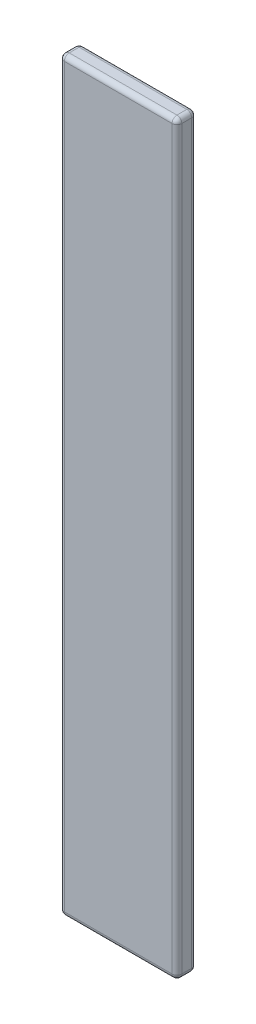
ISO-10303-21;
HEADER;
FILE_DESCRIPTION(('STEP AP214'),'2;1');
FILE_NAME('part.step','',(''),(''),'','','');
FILE_SCHEMA(('AUTOMOTIVE_DESIGN { 1 0 10303 214 1 1 1 1 }'));
ENDSEC;
DATA;
#1=APPLICATION_CONTEXT('core data for automotive mechanical design processes');
#2=APPLICATION_PROTOCOL_DEFINITION('international standard','automotive_design',2000,#1);
#3=PRODUCT_CONTEXT('',#1,'mechanical');
#4=PRODUCT('Part','Part','',(#3));
#5=PRODUCT_RELATED_PRODUCT_CATEGORY('part','',(#4));
#6=PRODUCT_DEFINITION_FORMATION('','',#4);
#7=PRODUCT_DEFINITION_CONTEXT('part definition',#1,'design');
#8=PRODUCT_DEFINITION('design','',#6,#7);
#9=PRODUCT_DEFINITION_SHAPE('','',#8);
#10=(LENGTH_UNIT() NAMED_UNIT(*) SI_UNIT(.MILLI.,.METRE.));
#11=(NAMED_UNIT(*) PLANE_ANGLE_UNIT() SI_UNIT($,.RADIAN.));
#12=(NAMED_UNIT(*) SI_UNIT($,.STERADIAN.) SOLID_ANGLE_UNIT());
#13=UNCERTAINTY_MEASURE_WITH_UNIT(LENGTH_MEASURE(1.E-05),#10,'distance_accuracy_value','');
#14=(GEOMETRIC_REPRESENTATION_CONTEXT(3) GLOBAL_UNCERTAINTY_ASSIGNED_CONTEXT((#13)) GLOBAL_UNIT_ASSIGNED_CONTEXT((#10,
#11,#12)) REPRESENTATION_CONTEXT('',''));
#15=CARTESIAN_POINT('',(0.,0.,0.));
#16=DIRECTION('',(0.,0.,1.));
#17=DIRECTION('',(1.,0.,0.));
#18=AXIS2_PLACEMENT_3D('',#15,#16,#17);
#19=CARTESIAN_POINT('',(24.,-152.5,8.));
#20=DIRECTION('',(-1.,0.,0.));
#21=DIRECTION('',(0.,0.,1.));
#22=AXIS2_PLACEMENT_3D('',#19,#20,#21);
#23=PLANE('',#22);
#24=DIRECTION('',(0.,1.,0.));
#25=VECTOR('',#24,1.);
#26=CARTESIAN_POINT('',(24.,-152.5,6.));
#27=LINE('',#26,#25);
#28=CARTESIAN_POINT('',(24.,150.5,6.));
#29=VERTEX_POINT('',#28);
#30=CARTESIAN_POINT('',(24.,-150.5,6.));
#31=VERTEX_POINT('',#30);
#32=EDGE_CURVE('E196',#29,#31,#27,.F.);
#33=ORIENTED_EDGE('',*,*,#32,.T.);
#34=DIRECTION('',(0.,0.,-1.));
#35=VECTOR('',#34,1.);
#36=CARTESIAN_POINT('',(24.,-150.5,8.));
#37=LINE('',#36,#35);
#38=CARTESIAN_POINT('',(24.,-150.5,2.));
#39=VERTEX_POINT('',#38);
#40=EDGE_CURVE('E201',#31,#39,#37,.T.);
#41=ORIENTED_EDGE('',*,*,#40,.T.);
#42=DIRECTION('',(0.,1.,0.));
#43=VECTOR('',#42,1.);
#44=CARTESIAN_POINT('',(24.,152.5,2.));
#45=LINE('',#44,#43);
#46=CARTESIAN_POINT('',(24.,150.5,2.));
#47=VERTEX_POINT('',#46);
#48=EDGE_CURVE('E198',#39,#47,#45,.T.);
#49=ORIENTED_EDGE('',*,*,#48,.T.);
#50=DIRECTION('',(0.,0.,-1.));
#51=VECTOR('',#50,1.);
#52=CARTESIAN_POINT('',(24.,150.5,8.));
#53=LINE('',#52,#51);
#54=EDGE_CURVE('E194',#47,#29,#53,.F.);
#55=ORIENTED_EDGE('',*,*,#54,.T.);
#56=EDGE_LOOP('',(#33,#41,#49,#55));
#57=FACE_BOUND('',#56,.T.);
#58=ADVANCED_FACE('F39',(#57),#23,.F.);
#59=CARTESIAN_POINT('',(-24.,152.5,8.));
#60=DIRECTION('',(0.,-1.,0.));
#61=DIRECTION('',(0.,0.,-1.));
#62=AXIS2_PLACEMENT_3D('',#59,#60,#61);
#63=PLANE('',#62);
#64=DIRECTION('',(-1.,0.,0.));
#65=VECTOR('',#64,1.);
#66=CARTESIAN_POINT('',(-24.,152.5,2.));
#67=LINE('',#66,#65);
#68=CARTESIAN_POINT('',(22.,152.5,2.));
#69=VERTEX_POINT('',#68);
#70=CARTESIAN_POINT('',(-22.,152.5,2.));
#71=VERTEX_POINT('',#70);
#72=EDGE_CURVE('E138',#69,#71,#67,.T.);
#73=ORIENTED_EDGE('',*,*,#72,.T.);
#74=DIRECTION('',(0.,0.,-1.));
#75=VECTOR('',#74,1.);
#76=CARTESIAN_POINT('',(-22.,152.5,8.));
#77=LINE('',#76,#75);
#78=CARTESIAN_POINT('',(-22.,152.5,6.));
#79=VERTEX_POINT('',#78);
#80=EDGE_CURVE('E134',#71,#79,#77,.F.);
#81=ORIENTED_EDGE('',*,*,#80,.T.);
#82=DIRECTION('',(-1.,0.,0.));
#83=VECTOR('',#82,1.);
#84=CARTESIAN_POINT('',(-24.,152.5,6.));
#85=LINE('',#84,#83);
#86=CARTESIAN_POINT('',(22.,152.5,6.));
#87=VERTEX_POINT('',#86);
#88=EDGE_CURVE('E126',#79,#87,#85,.F.);
#89=ORIENTED_EDGE('',*,*,#88,.T.);
#90=DIRECTION('',(0.,0.,-1.));
#91=VECTOR('',#90,1.);
#92=CARTESIAN_POINT('',(22.,152.5,8.));
#93=LINE('',#92,#91);
#94=EDGE_CURVE('E131',#87,#69,#93,.T.);
#95=ORIENTED_EDGE('',*,*,#94,.T.);
#96=EDGE_LOOP('',(#73,#81,#89,#95));
#97=FACE_BOUND('',#96,.T.);
#98=ADVANCED_FACE('F129',(#97),#63,.F.);
#99=CARTESIAN_POINT('',(-24.,-152.5,8.));
#100=DIRECTION('',(1.,0.,0.));
#101=DIRECTION('',(0.,0.,-1.));
#102=AXIS2_PLACEMENT_3D('',#99,#100,#101);
#103=PLANE('',#102);
#104=DIRECTION('',(0.,-1.,0.));
#105=VECTOR('',#104,1.);
#106=CARTESIAN_POINT('',(-24.,-152.5,2.));
#107=LINE('',#106,#105);
#108=CARTESIAN_POINT('',(-24.,150.5,2.));
#109=VERTEX_POINT('',#108);
#110=CARTESIAN_POINT('',(-24.,-150.5,2.));
#111=VERTEX_POINT('',#110);
#112=EDGE_CURVE('E180',#109,#111,#107,.T.);
#113=ORIENTED_EDGE('',*,*,#112,.T.);
#114=DIRECTION('',(0.,0.,-1.));
#115=VECTOR('',#114,1.);
#116=CARTESIAN_POINT('',(-24.,-150.5,8.));
#117=LINE('',#116,#115);
#118=CARTESIAN_POINT('',(-24.,-150.5,6.));
#119=VERTEX_POINT('',#118);
#120=EDGE_CURVE('E183',#111,#119,#117,.F.);
#121=ORIENTED_EDGE('',*,*,#120,.T.);
#122=DIRECTION('',(0.,-1.,0.));
#123=VECTOR('',#122,1.);
#124=CARTESIAN_POINT('',(-24.,-152.5,6.));
#125=LINE('',#124,#123);
#126=CARTESIAN_POINT('',(-24.,150.5,6.));
#127=VERTEX_POINT('',#126);
#128=EDGE_CURVE('E178',#119,#127,#125,.F.);
#129=ORIENTED_EDGE('',*,*,#128,.T.);
#130=DIRECTION('',(0.,0.,-1.));
#131=VECTOR('',#130,1.);
#132=CARTESIAN_POINT('',(-24.,150.5,8.));
#133=LINE('',#132,#131);
#134=EDGE_CURVE('E176',#127,#109,#133,.T.);
#135=ORIENTED_EDGE('',*,*,#134,.T.);
#136=EDGE_LOOP('',(#113,#121,#129,#135));
#137=FACE_BOUND('',#136,.T.);
#138=ADVANCED_FACE('F269',(#137),#103,.F.);
#139=CARTESIAN_POINT('',(-24.,-152.5,8.));
#140=DIRECTION('',(0.,1.,0.));
#141=DIRECTION('',(0.,0.,1.));
#142=AXIS2_PLACEMENT_3D('',#139,#140,#141);
#143=PLANE('',#142);
#144=DIRECTION('',(1.,0.,0.));
#145=VECTOR('',#144,1.);
#146=CARTESIAN_POINT('',(24.,-152.5,2.));
#147=LINE('',#146,#145);
#148=CARTESIAN_POINT('',(-22.,-152.5,2.));
#149=VERTEX_POINT('',#148);
#150=CARTESIAN_POINT('',(22.,-152.5,2.));
#151=VERTEX_POINT('',#150);
#152=EDGE_CURVE('E189',#149,#151,#147,.T.);
#153=ORIENTED_EDGE('',*,*,#152,.T.);
#154=DIRECTION('',(0.,0.,-1.));
#155=VECTOR('',#154,1.);
#156=CARTESIAN_POINT('',(22.,-152.5,8.));
#157=LINE('',#156,#155);
#158=CARTESIAN_POINT('',(22.,-152.5,6.));
#159=VERTEX_POINT('',#158);
#160=EDGE_CURVE('E192',#151,#159,#157,.F.);
#161=ORIENTED_EDGE('',*,*,#160,.T.);
#162=DIRECTION('',(1.,0.,0.));
#163=VECTOR('',#162,1.);
#164=CARTESIAN_POINT('',(-24.,-152.5,6.));
#165=LINE('',#164,#163);
#166=CARTESIAN_POINT('',(-22.,-152.5,6.));
#167=VERTEX_POINT('',#166);
#168=EDGE_CURVE('E187',#159,#167,#165,.F.);
#169=ORIENTED_EDGE('',*,*,#168,.T.);
#170=DIRECTION('',(0.,0.,-1.));
#171=VECTOR('',#170,1.);
#172=CARTESIAN_POINT('',(-22.,-152.5,8.));
#173=LINE('',#172,#171);
#174=EDGE_CURVE('E185',#167,#149,#173,.T.);
#175=ORIENTED_EDGE('',*,*,#174,.T.);
#176=EDGE_LOOP('',(#153,#161,#169,#175));
#177=FACE_BOUND('',#176,.T.);
#178=ADVANCED_FACE('F278',(#177),#143,.F.);
#179=CARTESIAN_POINT('',(0.,0.,8.));
#180=DIRECTION('',(0.,0.,-1.));
#181=DIRECTION('',(-1.,0.,0.));
#182=AXIS2_PLACEMENT_3D('',#179,#180,#181);
#183=PLANE('',#182);
#184=DIRECTION('',(0.,-1.,0.));
#185=VECTOR('',#184,1.);
#186=CARTESIAN_POINT('',(-22.,0.,8.));
#187=LINE('',#186,#185);
#188=CARTESIAN_POINT('',(-22.,150.5,8.));
#189=VERTEX_POINT('',#188);
#190=CARTESIAN_POINT('',(-22.,-150.5,8.));
#191=VERTEX_POINT('',#190);
#192=EDGE_CURVE('E48',#189,#191,#187,.T.);
#193=ORIENTED_EDGE('',*,*,#192,.T.);
#194=DIRECTION('',(1.,0.,0.));
#195=VECTOR('',#194,1.);
#196=CARTESIAN_POINT('',(0.,-150.5,8.));
#197=LINE('',#196,#195);
#198=CARTESIAN_POINT('',(22.,-150.5,8.));
#199=VERTEX_POINT('',#198);
#200=EDGE_CURVE('E11',#191,#199,#197,.T.);
#201=ORIENTED_EDGE('',*,*,#200,.T.);
#202=DIRECTION('',(0.,1.,0.));
#203=VECTOR('',#202,1.);
#204=CARTESIAN_POINT('',(22.,0.,8.));
#205=LINE('',#204,#203);
#206=CARTESIAN_POINT('',(22.,150.5,8.));
#207=VERTEX_POINT('',#206);
#208=EDGE_CURVE('E203',#199,#207,#205,.T.);
#209=ORIENTED_EDGE('',*,*,#208,.T.);
#210=DIRECTION('',(-1.,0.,0.));
#211=VECTOR('',#210,1.);
#212=CARTESIAN_POINT('',(0.,150.5,8.));
#213=LINE('',#212,#211);
#214=EDGE_CURVE('E59',#207,#189,#213,.T.);
#215=ORIENTED_EDGE('',*,*,#214,.T.);
#216=EDGE_LOOP('',(#193,#201,#209,#215));
#217=FACE_BOUND('',#216,.T.);
#218=ADVANCED_FACE('F300',(#217),#183,.F.);
#219=CARTESIAN_POINT('',(0.,0.,0.));
#220=DIRECTION('',(0.,0.,-1.));
#221=DIRECTION('',(-1.,0.,0.));
#222=AXIS2_PLACEMENT_3D('',#219,#220,#221);
#223=PLANE('',#222);
#224=DIRECTION('',(0.,-1.,0.));
#225=VECTOR('',#224,1.);
#226=CARTESIAN_POINT('',(-22.,152.5,0.));
#227=LINE('',#226,#225);
#228=CARTESIAN_POINT('',(-22.,-150.5,0.));
#229=VERTEX_POINT('',#228);
#230=CARTESIAN_POINT('',(-22.,150.5,0.));
#231=VERTEX_POINT('',#230);
#232=EDGE_CURVE('E171',#229,#231,#227,.F.);
#233=ORIENTED_EDGE('',*,*,#232,.T.);
#234=DIRECTION('',(-1.,0.,0.));
#235=VECTOR('',#234,1.);
#236=CARTESIAN_POINT('',(24.,150.5,0.));
#237=LINE('',#236,#235);
#238=CARTESIAN_POINT('',(22.,150.5,0.));
#239=VERTEX_POINT('',#238);
#240=EDGE_CURVE('E173',#231,#239,#237,.F.);
#241=ORIENTED_EDGE('',*,*,#240,.T.);
#242=DIRECTION('',(0.,1.,0.));
#243=VECTOR('',#242,1.);
#244=CARTESIAN_POINT('',(22.,-152.5,0.));
#245=LINE('',#244,#243);
#246=CARTESIAN_POINT('',(22.,-150.5,0.));
#247=VERTEX_POINT('',#246);
#248=EDGE_CURVE('E167',#239,#247,#245,.F.);
#249=ORIENTED_EDGE('',*,*,#248,.T.);
#250=DIRECTION('',(1.,0.,0.));
#251=VECTOR('',#250,1.);
#252=CARTESIAN_POINT('',(-24.,-150.5,0.));
#253=LINE('',#252,#251);
#254=EDGE_CURVE('E169',#247,#229,#253,.F.);
#255=ORIENTED_EDGE('',*,*,#254,.T.);
#256=EDGE_LOOP('',(#233,#241,#249,#255));
#257=FACE_BOUND('',#256,.T.);
#258=ADVANCED_FACE('F302',(#257),#223,.T.);
#259=CARTESIAN_POINT('',(0.,-150.5,6.));
#260=DIRECTION('',(1.,0.,0.));
#261=DIRECTION('',(0.,0.,-1.));
#262=AXIS2_PLACEMENT_3D('',#259,#260,#261);
#263=CYLINDRICAL_SURFACE('',#262,2.);
#264=CARTESIAN_POINT('',(22.,-150.5,6.));
#265=DIRECTION('',(1.,0.,0.));
#266=DIRECTION('',(0.,0.,-1.));
#267=AXIS2_PLACEMENT_3D('',#264,#265,#266);
#268=CIRCLE('',#267,2.);
#269=EDGE_CURVE('E43',#199,#159,#268,.T.);
#270=ORIENTED_EDGE('',*,*,#269,.F.);
#271=ORIENTED_EDGE('',*,*,#200,.F.);
#272=CARTESIAN_POINT('',(-22.,-150.5,6.));
#273=DIRECTION('',(-1.,0.,0.));
#274=DIRECTION('',(0.,0.,1.));
#275=AXIS2_PLACEMENT_3D('',#272,#273,#274);
#276=CIRCLE('',#275,2.);
#277=EDGE_CURVE('E163',#167,#191,#276,.T.);
#278=ORIENTED_EDGE('',*,*,#277,.F.);
#279=ORIENTED_EDGE('',*,*,#168,.F.);
#280=EDGE_LOOP('',(#270,#271,#278,#279));
#281=FACE_BOUND('',#280,.T.);
#282=ADVANCED_FACE('F41',(#281),#263,.T.);
#283=CARTESIAN_POINT('',(22.,-150.5,6.));
#284=DIRECTION('',(0.,0.,1.));
#285=DIRECTION('',(1.,0.,0.));
#286=AXIS2_PLACEMENT_3D('',#283,#284,#285);
#287=SPHERICAL_SURFACE('',#286,2.);
#288=CARTESIAN_POINT('',(22.,-150.5,6.));
#289=DIRECTION('',(0.,-1.,0.));
#290=DIRECTION('',(0.,0.,-1.));
#291=AXIS2_PLACEMENT_3D('',#288,#289,#290);
#292=CIRCLE('',#291,2.);
#293=EDGE_CURVE('E249',#199,#31,#292,.F.);
#294=ORIENTED_EDGE('',*,*,#293,.F.);
#295=ORIENTED_EDGE('',*,*,#269,.T.);
#296=CARTESIAN_POINT('',(22.,-150.5,6.));
#297=DIRECTION('',(0.,0.,1.));
#298=DIRECTION('',(1.,0.,0.));
#299=AXIS2_PLACEMENT_3D('',#296,#297,#298);
#300=CIRCLE('',#299,2.);
#301=EDGE_CURVE('E252',#31,#159,#300,.F.);
#302=ORIENTED_EDGE('',*,*,#301,.F.);
#303=EDGE_LOOP('',(#294,#295,#302));
#304=FACE_BOUND('',#303,.T.);
#305=ADVANCED_FACE('F296',(#304),#287,.T.);
#306=CARTESIAN_POINT('',(-22.,-150.5,6.));
#307=DIRECTION('',(0.,0.,1.));
#308=DIRECTION('',(1.,0.,0.));
#309=AXIS2_PLACEMENT_3D('',#306,#307,#308);
#310=SPHERICAL_SURFACE('',#309,2.);
#311=CARTESIAN_POINT('',(-22.,-150.5,6.));
#312=DIRECTION('',(0.,0.,1.));
#313=DIRECTION('',(1.,0.,0.));
#314=AXIS2_PLACEMENT_3D('',#311,#312,#313);
#315=CIRCLE('',#314,2.);
#316=EDGE_CURVE('E243',#167,#119,#315,.F.);
#317=ORIENTED_EDGE('',*,*,#316,.F.);
#318=ORIENTED_EDGE('',*,*,#277,.T.);
#319=CARTESIAN_POINT('',(-22.,-150.5,6.));
#320=DIRECTION('',(0.,-1.,0.));
#321=DIRECTION('',(0.,0.,-1.));
#322=AXIS2_PLACEMENT_3D('',#319,#320,#321);
#323=CIRCLE('',#322,2.);
#324=EDGE_CURVE('E246',#119,#191,#323,.F.);
#325=ORIENTED_EDGE('',*,*,#324,.F.);
#326=EDGE_LOOP('',(#317,#318,#325));
#327=FACE_BOUND('',#326,.T.);
#328=ADVANCED_FACE('F259',(#327),#310,.T.);
#329=CARTESIAN_POINT('',(22.,-150.5,8.));
#330=DIRECTION('',(0.,0.,-1.));
#331=DIRECTION('',(-1.,0.,0.));
#332=AXIS2_PLACEMENT_3D('',#329,#330,#331);
#333=CYLINDRICAL_SURFACE('',#332,2.);
#334=ORIENTED_EDGE('',*,*,#301,.T.);
#335=ORIENTED_EDGE('',*,*,#160,.F.);
#336=CARTESIAN_POINT('',(22.,-150.5,2.));
#337=DIRECTION('',(0.,0.,-1.));
#338=DIRECTION('',(-1.,0.,0.));
#339=AXIS2_PLACEMENT_3D('',#336,#337,#338);
#340=CIRCLE('',#339,2.);
#341=EDGE_CURVE('E238',#39,#151,#340,.T.);
#342=ORIENTED_EDGE('',*,*,#341,.F.);
#343=ORIENTED_EDGE('',*,*,#40,.F.);
#344=EDGE_LOOP('',(#334,#335,#342,#343));
#345=FACE_BOUND('',#344,.T.);
#346=ADVANCED_FACE('F290',(#345),#333,.T.);
#347=CARTESIAN_POINT('',(22.,0.,6.));
#348=DIRECTION('',(0.,1.,0.));
#349=DIRECTION('',(0.,0.,1.));
#350=AXIS2_PLACEMENT_3D('',#347,#348,#349);
#351=CYLINDRICAL_SURFACE('',#350,2.);
#352=ORIENTED_EDGE('',*,*,#293,.T.);
#353=ORIENTED_EDGE('',*,*,#32,.F.);
#354=CARTESIAN_POINT('',(22.,150.5,6.));
#355=DIRECTION('',(0.,1.,0.));
#356=DIRECTION('',(0.,0.,1.));
#357=AXIS2_PLACEMENT_3D('',#354,#355,#356);
#358=CIRCLE('',#357,2.);
#359=EDGE_CURVE('E147',#207,#29,#358,.T.);
#360=ORIENTED_EDGE('',*,*,#359,.F.);
#361=ORIENTED_EDGE('',*,*,#208,.F.);
#362=EDGE_LOOP('',(#352,#353,#360,#361));
#363=FACE_BOUND('',#362,.T.);
#364=ADVANCED_FACE('F299',(#363),#351,.T.);
#365=CARTESIAN_POINT('',(0.,150.5,6.));
#366=DIRECTION('',(-1.,0.,0.));
#367=DIRECTION('',(0.,0.,1.));
#368=AXIS2_PLACEMENT_3D('',#365,#366,#367);
#369=CYLINDRICAL_SURFACE('',#368,2.);
#370=CARTESIAN_POINT('',(-22.,150.5,6.));
#371=DIRECTION('',(-1.,0.,0.));
#372=DIRECTION('',(0.,0.,1.));
#373=AXIS2_PLACEMENT_3D('',#370,#371,#372);
#374=CIRCLE('',#373,2.);
#375=EDGE_CURVE('E148',#189,#79,#374,.T.);
#376=ORIENTED_EDGE('',*,*,#375,.F.);
#377=ORIENTED_EDGE('',*,*,#214,.F.);
#378=CARTESIAN_POINT('',(22.,150.5,6.));
#379=DIRECTION('',(1.,0.,0.));
#380=DIRECTION('',(0.,0.,-1.));
#381=AXIS2_PLACEMENT_3D('',#378,#379,#380);
#382=CIRCLE('',#381,2.);
#383=EDGE_CURVE('E141',#87,#207,#382,.T.);
#384=ORIENTED_EDGE('',*,*,#383,.F.);
#385=ORIENTED_EDGE('',*,*,#88,.F.);
#386=EDGE_LOOP('',(#376,#377,#384,#385));
#387=FACE_BOUND('',#386,.T.);
#388=ADVANCED_FACE('F143',(#387),#369,.T.);
#389=CARTESIAN_POINT('',(-22.,0.,6.));
#390=DIRECTION('',(0.,-1.,0.));
#391=DIRECTION('',(0.,0.,-1.));
#392=AXIS2_PLACEMENT_3D('',#389,#390,#391);
#393=CYLINDRICAL_SURFACE('',#392,2.);
#394=ORIENTED_EDGE('',*,*,#324,.T.);
#395=ORIENTED_EDGE('',*,*,#192,.F.);
#396=CARTESIAN_POINT('',(-22.,150.5,6.));
#397=DIRECTION('',(0.,1.,0.));
#398=DIRECTION('',(0.,0.,1.));
#399=AXIS2_PLACEMENT_3D('',#396,#397,#398);
#400=CIRCLE('',#399,2.);
#401=EDGE_CURVE('E233',#127,#189,#400,.T.);
#402=ORIENTED_EDGE('',*,*,#401,.F.);
#403=ORIENTED_EDGE('',*,*,#128,.F.);
#404=EDGE_LOOP('',(#394,#395,#402,#403));
#405=FACE_BOUND('',#404,.T.);
#406=ADVANCED_FACE('F265',(#405),#393,.T.);
#407=CARTESIAN_POINT('',(-22.,-150.5,8.));
#408=DIRECTION('',(0.,0.,-1.));
#409=DIRECTION('',(-1.,0.,0.));
#410=AXIS2_PLACEMENT_3D('',#407,#408,#409);
#411=CYLINDRICAL_SURFACE('',#410,2.);
#412=ORIENTED_EDGE('',*,*,#316,.T.);
#413=ORIENTED_EDGE('',*,*,#120,.F.);
#414=CARTESIAN_POINT('',(-22.,-150.5,2.));
#415=DIRECTION('',(0.,0.,-1.));
#416=DIRECTION('',(-1.,0.,0.));
#417=AXIS2_PLACEMENT_3D('',#414,#415,#416);
#418=CIRCLE('',#417,2.);
#419=EDGE_CURVE('E230',#149,#111,#418,.T.);
#420=ORIENTED_EDGE('',*,*,#419,.F.);
#421=ORIENTED_EDGE('',*,*,#174,.F.);
#422=EDGE_LOOP('',(#412,#413,#420,#421));
#423=FACE_BOUND('',#422,.T.);
#424=ADVANCED_FACE('F275',(#423),#411,.T.);
#425=CARTESIAN_POINT('',(-24.,-150.5,2.));
#426=DIRECTION('',(-1.,0.,0.));
#427=DIRECTION('',(0.,0.,1.));
#428=AXIS2_PLACEMENT_3D('',#425,#426,#427);
#429=CYLINDRICAL_SURFACE('',#428,2.);
#430=CARTESIAN_POINT('',(22.,-150.5,2.));
#431=DIRECTION('',(1.,0.,0.));
#432=DIRECTION('',(0.,0.,-1.));
#433=AXIS2_PLACEMENT_3D('',#430,#431,#432);
#434=CIRCLE('',#433,2.);
#435=EDGE_CURVE('E240',#151,#247,#434,.T.);
#436=ORIENTED_EDGE('',*,*,#435,.F.);
#437=ORIENTED_EDGE('',*,*,#152,.F.);
#438=CARTESIAN_POINT('',(-22.,-150.5,2.));
#439=DIRECTION('',(-1.,0.,0.));
#440=DIRECTION('',(0.,0.,1.));
#441=AXIS2_PLACEMENT_3D('',#438,#439,#440);
#442=CIRCLE('',#441,2.);
#443=EDGE_CURVE('E227',#229,#149,#442,.T.);
#444=ORIENTED_EDGE('',*,*,#443,.F.);
#445=ORIENTED_EDGE('',*,*,#254,.F.);
#446=EDGE_LOOP('',(#436,#437,#444,#445));
#447=FACE_BOUND('',#446,.T.);
#448=ADVANCED_FACE('F282',(#447),#429,.T.);
#449=CARTESIAN_POINT('',(22.,-150.5,2.));
#450=DIRECTION('',(0.,0.,1.));
#451=DIRECTION('',(1.,0.,0.));
#452=AXIS2_PLACEMENT_3D('',#449,#450,#451);
#453=SPHERICAL_SURFACE('',#452,2.);
#454=ORIENTED_EDGE('',*,*,#341,.T.);
#455=ORIENTED_EDGE('',*,*,#435,.T.);
#456=CARTESIAN_POINT('',(22.,-150.5,2.));
#457=DIRECTION('',(0.,-1.,0.));
#458=DIRECTION('',(0.,0.,-1.));
#459=AXIS2_PLACEMENT_3D('',#456,#457,#458);
#460=CIRCLE('',#459,2.);
#461=EDGE_CURVE('E155',#39,#247,#460,.F.);
#462=ORIENTED_EDGE('',*,*,#461,.F.);
#463=EDGE_LOOP('',(#454,#455,#462));
#464=FACE_BOUND('',#463,.T.);
#465=ADVANCED_FACE('F356',(#464),#453,.T.);
#466=CARTESIAN_POINT('',(22.,150.5,6.));
#467=DIRECTION('',(0.,0.,1.));
#468=DIRECTION('',(1.,0.,0.));
#469=AXIS2_PLACEMENT_3D('',#466,#467,#468);
#470=SPHERICAL_SURFACE('',#469,2.);
#471=ORIENTED_EDGE('',*,*,#383,.T.);
#472=ORIENTED_EDGE('',*,*,#359,.T.);
#473=CARTESIAN_POINT('',(22.,150.5,6.));
#474=DIRECTION('',(0.,0.,1.));
#475=DIRECTION('',(1.,0.,0.));
#476=AXIS2_PLACEMENT_3D('',#473,#474,#475);
#477=CIRCLE('',#476,2.);
#478=EDGE_CURVE('E151',#87,#29,#477,.F.);
#479=ORIENTED_EDGE('',*,*,#478,.F.);
#480=EDGE_LOOP('',(#471,#472,#479));
#481=FACE_BOUND('',#480,.T.);
#482=ADVANCED_FACE('F152',(#481),#470,.T.);
#483=CARTESIAN_POINT('',(-22.,150.5,6.));
#484=DIRECTION('',(0.,0.,1.));
#485=DIRECTION('',(1.,0.,0.));
#486=AXIS2_PLACEMENT_3D('',#483,#484,#485);
#487=SPHERICAL_SURFACE('',#486,2.);
#488=ORIENTED_EDGE('',*,*,#401,.T.);
#489=ORIENTED_EDGE('',*,*,#375,.T.);
#490=CARTESIAN_POINT('',(-22.,150.5,6.));
#491=DIRECTION('',(0.,0.,1.));
#492=DIRECTION('',(1.,0.,0.));
#493=AXIS2_PLACEMENT_3D('',#490,#491,#492);
#494=CIRCLE('',#493,2.);
#495=EDGE_CURVE('E156',#127,#79,#494,.F.);
#496=ORIENTED_EDGE('',*,*,#495,.F.);
#497=EDGE_LOOP('',(#488,#489,#496));
#498=FACE_BOUND('',#497,.T.);
#499=ADVANCED_FACE('F349',(#498),#487,.T.);
#500=CARTESIAN_POINT('',(-22.,-150.5,2.));
#501=DIRECTION('',(0.,0.,1.));
#502=DIRECTION('',(1.,0.,0.));
#503=AXIS2_PLACEMENT_3D('',#500,#501,#502);
#504=SPHERICAL_SURFACE('',#503,2.);
#505=ORIENTED_EDGE('',*,*,#443,.T.);
#506=ORIENTED_EDGE('',*,*,#419,.T.);
#507=CARTESIAN_POINT('',(-22.,-150.5,2.));
#508=DIRECTION('',(0.,-1.,0.));
#509=DIRECTION('',(0.,0.,-1.));
#510=AXIS2_PLACEMENT_3D('',#507,#508,#509);
#511=CIRCLE('',#510,2.);
#512=EDGE_CURVE('E221',#229,#111,#511,.F.);
#513=ORIENTED_EDGE('',*,*,#512,.F.);
#514=EDGE_LOOP('',(#505,#506,#513));
#515=FACE_BOUND('',#514,.T.);
#516=ADVANCED_FACE('F345',(#515),#504,.T.);
#517=CARTESIAN_POINT('',(22.,-152.5,2.));
#518=DIRECTION('',(0.,-1.,0.));
#519=DIRECTION('',(0.,0.,-1.));
#520=AXIS2_PLACEMENT_3D('',#517,#518,#519);
#521=CYLINDRICAL_SURFACE('',#520,2.);
#522=ORIENTED_EDGE('',*,*,#461,.T.);
#523=ORIENTED_EDGE('',*,*,#248,.F.);
#524=CARTESIAN_POINT('',(22.,150.5,2.));
#525=DIRECTION('',(0.,1.,0.));
#526=DIRECTION('',(0.,0.,1.));
#527=AXIS2_PLACEMENT_3D('',#524,#525,#526);
#528=CIRCLE('',#527,2.);
#529=EDGE_CURVE('E218',#47,#239,#528,.T.);
#530=ORIENTED_EDGE('',*,*,#529,.F.);
#531=ORIENTED_EDGE('',*,*,#48,.F.);
#532=EDGE_LOOP('',(#522,#523,#530,#531));
#533=FACE_BOUND('',#532,.T.);
#534=ADVANCED_FACE('F342',(#533),#521,.T.);
#535=CARTESIAN_POINT('',(22.,150.5,8.));
#536=DIRECTION('',(0.,0.,-1.));
#537=DIRECTION('',(-1.,0.,0.));
#538=AXIS2_PLACEMENT_3D('',#535,#536,#537);
#539=CYLINDRICAL_SURFACE('',#538,2.);
#540=ORIENTED_EDGE('',*,*,#478,.T.);
#541=ORIENTED_EDGE('',*,*,#54,.F.);
#542=CARTESIAN_POINT('',(22.,150.5,2.));
#543=DIRECTION('',(0.,0.,-1.));
#544=DIRECTION('',(-1.,0.,0.));
#545=AXIS2_PLACEMENT_3D('',#542,#543,#544);
#546=CIRCLE('',#545,2.);
#547=EDGE_CURVE('E159',#69,#47,#546,.T.);
#548=ORIENTED_EDGE('',*,*,#547,.F.);
#549=ORIENTED_EDGE('',*,*,#94,.F.);
#550=EDGE_LOOP('',(#540,#541,#548,#549));
#551=FACE_BOUND('',#550,.T.);
#552=ADVANCED_FACE('F158',(#551),#539,.T.);
#553=CARTESIAN_POINT('',(-22.,150.5,8.));
#554=DIRECTION('',(0.,0.,-1.));
#555=DIRECTION('',(-1.,0.,0.));
#556=AXIS2_PLACEMENT_3D('',#553,#554,#555);
#557=CYLINDRICAL_SURFACE('',#556,2.);
#558=ORIENTED_EDGE('',*,*,#495,.T.);
#559=ORIENTED_EDGE('',*,*,#80,.F.);
#560=CARTESIAN_POINT('',(-22.,150.5,2.));
#561=DIRECTION('',(0.,0.,-1.));
#562=DIRECTION('',(-1.,0.,0.));
#563=AXIS2_PLACEMENT_3D('',#560,#561,#562);
#564=CIRCLE('',#563,2.);
#565=EDGE_CURVE('E214',#109,#71,#564,.T.);
#566=ORIENTED_EDGE('',*,*,#565,.F.);
#567=ORIENTED_EDGE('',*,*,#134,.F.);
#568=EDGE_LOOP('',(#558,#559,#566,#567));
#569=FACE_BOUND('',#568,.T.);
#570=ADVANCED_FACE('F335',(#569),#557,.T.);
#571=CARTESIAN_POINT('',(-22.,-152.5,2.));
#572=DIRECTION('',(0.,1.,0.));
#573=DIRECTION('',(0.,0.,1.));
#574=AXIS2_PLACEMENT_3D('',#571,#572,#573);
#575=CYLINDRICAL_SURFACE('',#574,2.);
#576=ORIENTED_EDGE('',*,*,#512,.T.);
#577=ORIENTED_EDGE('',*,*,#112,.F.);
#578=CARTESIAN_POINT('',(-22.,150.5,2.));
#579=DIRECTION('',(0.,1.,0.));
#580=DIRECTION('',(0.,0.,1.));
#581=AXIS2_PLACEMENT_3D('',#578,#579,#580);
#582=CIRCLE('',#581,2.);
#583=EDGE_CURVE('E211',#231,#109,#582,.T.);
#584=ORIENTED_EDGE('',*,*,#583,.F.);
#585=ORIENTED_EDGE('',*,*,#232,.F.);
#586=EDGE_LOOP('',(#576,#577,#584,#585));
#587=FACE_BOUND('',#586,.T.);
#588=ADVANCED_FACE('F331',(#587),#575,.T.);
#589=CARTESIAN_POINT('',(22.,150.5,2.));
#590=DIRECTION('',(0.,0.,1.));
#591=DIRECTION('',(1.,0.,0.));
#592=AXIS2_PLACEMENT_3D('',#589,#590,#591);
#593=SPHERICAL_SURFACE('',#592,2.);
#594=ORIENTED_EDGE('',*,*,#547,.T.);
#595=ORIENTED_EDGE('',*,*,#529,.T.);
#596=CARTESIAN_POINT('',(22.,150.5,2.));
#597=DIRECTION('',(1.,0.,0.));
#598=DIRECTION('',(0.,0.,-1.));
#599=AXIS2_PLACEMENT_3D('',#596,#597,#598);
#600=CIRCLE('',#599,2.);
#601=EDGE_CURVE('E209',#69,#239,#600,.F.);
#602=ORIENTED_EDGE('',*,*,#601,.F.);
#603=EDGE_LOOP('',(#594,#595,#602));
#604=FACE_BOUND('',#603,.T.);
#605=ADVANCED_FACE('F327',(#604),#593,.T.);
#606=CARTESIAN_POINT('',(-22.,150.5,2.));
#607=DIRECTION('',(0.,0.,1.));
#608=DIRECTION('',(1.,0.,0.));
#609=AXIS2_PLACEMENT_3D('',#606,#607,#608);
#610=SPHERICAL_SURFACE('',#609,2.);
#611=ORIENTED_EDGE('',*,*,#583,.T.);
#612=ORIENTED_EDGE('',*,*,#565,.T.);
#613=CARTESIAN_POINT('',(-22.,150.5,2.));
#614=DIRECTION('',(-1.,0.,0.));
#615=DIRECTION('',(0.,0.,1.));
#616=AXIS2_PLACEMENT_3D('',#613,#614,#615);
#617=CIRCLE('',#616,2.);
#618=EDGE_CURVE('E207',#231,#71,#617,.F.);
#619=ORIENTED_EDGE('',*,*,#618,.F.);
#620=EDGE_LOOP('',(#611,#612,#619));
#621=FACE_BOUND('',#620,.T.);
#622=ADVANCED_FACE('F323',(#621),#610,.T.);
#623=CARTESIAN_POINT('',(-24.,150.5,2.));
#624=DIRECTION('',(1.,0.,0.));
#625=DIRECTION('',(0.,0.,-1.));
#626=AXIS2_PLACEMENT_3D('',#623,#624,#625);
#627=CYLINDRICAL_SURFACE('',#626,2.);
#628=ORIENTED_EDGE('',*,*,#601,.T.);
#629=ORIENTED_EDGE('',*,*,#240,.F.);
#630=ORIENTED_EDGE('',*,*,#618,.T.);
#631=ORIENTED_EDGE('',*,*,#72,.F.);
#632=EDGE_LOOP('',(#628,#629,#630,#631));
#633=FACE_BOUND('',#632,.T.);
#634=ADVANCED_FACE('F320',(#633),#627,.T.);
#635=CLOSED_SHELL('',(#58,#98,#138,#178,#218,#258,#282,#305,#328,#346,#364,#388,#406,#424,#448,
#465,#482,#499,#516,#534,#552,#570,#588,#605,#622,#634));
#636=MANIFOLD_SOLID_BREP('B2',#635);
#637=ADVANCED_BREP_SHAPE_REPRESENTATION('',(#18,#636),#14);
#638=SHAPE_DEFINITION_REPRESENTATION(#9,#637);
ENDSEC;
END-ISO-10303-21;
